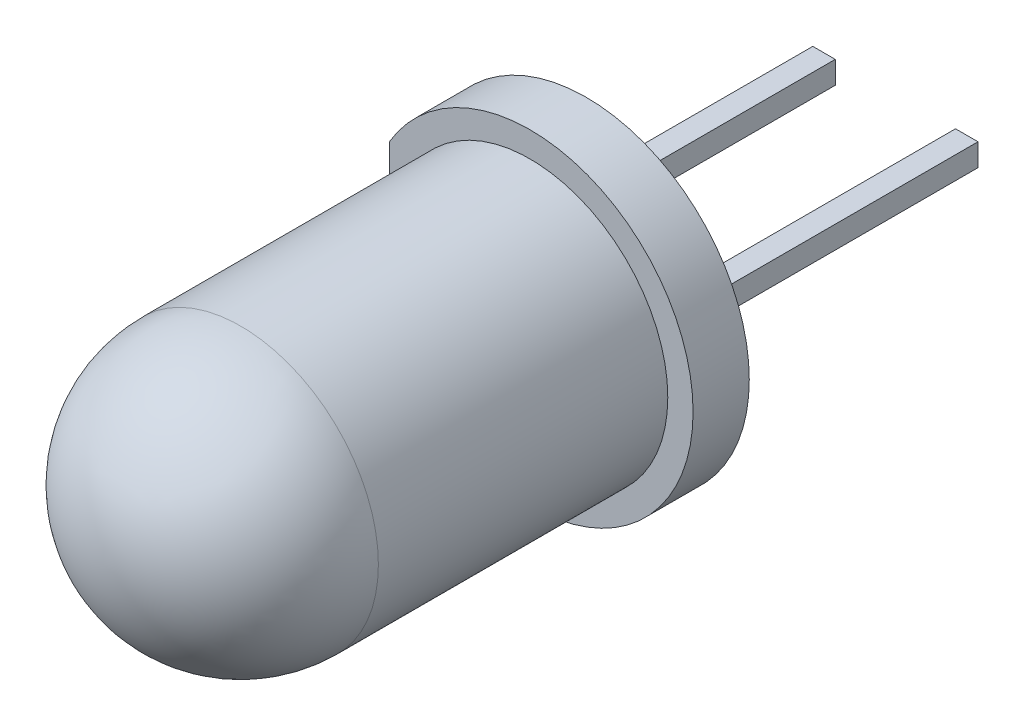
ISO-10303-21;
HEADER;
FILE_DESCRIPTION(('STEP AP214'),'2;1');
FILE_NAME('part.step','',(''),(''),'','','');
FILE_SCHEMA(('AUTOMOTIVE_DESIGN { 1 0 10303 214 1 1 1 1 }'));
ENDSEC;
DATA;
#1=APPLICATION_CONTEXT('core data for automotive mechanical design processes');
#2=APPLICATION_PROTOCOL_DEFINITION('international standard','automotive_design',2000,#1);
#3=PRODUCT_CONTEXT('',#1,'mechanical');
#4=PRODUCT('Part','Part','',(#3));
#5=PRODUCT_RELATED_PRODUCT_CATEGORY('part','',(#4));
#6=PRODUCT_DEFINITION_FORMATION('','',#4);
#7=PRODUCT_DEFINITION_CONTEXT('part definition',#1,'design');
#8=PRODUCT_DEFINITION('design','',#6,#7);
#9=PRODUCT_DEFINITION_SHAPE('','',#8);
#10=(LENGTH_UNIT() NAMED_UNIT(*) SI_UNIT(.MILLI.,.METRE.));
#11=(NAMED_UNIT(*) PLANE_ANGLE_UNIT() SI_UNIT($,.RADIAN.));
#12=(NAMED_UNIT(*) SI_UNIT($,.STERADIAN.) SOLID_ANGLE_UNIT());
#13=UNCERTAINTY_MEASURE_WITH_UNIT(LENGTH_MEASURE(1.E-05),#10,'distance_accuracy_value','');
#14=(GEOMETRIC_REPRESENTATION_CONTEXT(3) GLOBAL_UNCERTAINTY_ASSIGNED_CONTEXT((#13)) GLOBAL_UNIT_ASSIGNED_CONTEXT((#10,
#11,#12)) REPRESENTATION_CONTEXT('',''));
#15=CARTESIAN_POINT('',(0.,0.,0.));
#16=DIRECTION('',(0.,0.,1.));
#17=DIRECTION('',(1.,0.,0.));
#18=AXIS2_PLACEMENT_3D('',#15,#16,#17);
#19=CARTESIAN_POINT('',(2.34,0.2,-2.5));
#20=DIRECTION('',(0.,0.,1.));
#21=DIRECTION('',(1.,0.,0.));
#22=AXIS2_PLACEMENT_3D('',#19,#20,#21);
#23=PLANE('',#22);
#24=DIRECTION('',(1.,0.,0.));
#25=VECTOR('',#24,1.);
#26=CARTESIAN_POINT('',(2.34,0.2,-2.5));
#27=LINE('',#26,#25);
#28=CARTESIAN_POINT('',(2.34,0.2,-2.5));
#29=VERTEX_POINT('',#28);
#30=CARTESIAN_POINT('',(2.74,0.2,-2.5));
#31=VERTEX_POINT('',#30);
#32=EDGE_CURVE('E137',#29,#31,#27,.T.);
#33=ORIENTED_EDGE('',*,*,#32,.T.);
#34=DIRECTION('',(0.,-1.,0.));
#35=VECTOR('',#34,1.);
#36=CARTESIAN_POINT('',(2.74,0.2,-2.5));
#37=LINE('',#36,#35);
#38=CARTESIAN_POINT('',(2.74,-0.2,-2.5));
#39=VERTEX_POINT('',#38);
#40=EDGE_CURVE('E21',#31,#39,#37,.T.);
#41=ORIENTED_EDGE('',*,*,#40,.T.);
#42=DIRECTION('',(-1.,0.,0.));
#43=VECTOR('',#42,1.);
#44=CARTESIAN_POINT('',(2.74,-0.2,-2.5));
#45=LINE('',#44,#43);
#46=CARTESIAN_POINT('',(2.34,-0.2,-2.5));
#47=VERTEX_POINT('',#46);
#48=EDGE_CURVE('E11',#39,#47,#45,.T.);
#49=ORIENTED_EDGE('',*,*,#48,.T.);
#50=DIRECTION('',(0.,1.,0.));
#51=VECTOR('',#50,1.);
#52=CARTESIAN_POINT('',(2.34,-0.2,-2.5));
#53=LINE('',#52,#51);
#54=EDGE_CURVE('E143',#47,#29,#53,.T.);
#55=ORIENTED_EDGE('',*,*,#54,.T.);
#56=EDGE_LOOP('',(#33,#41,#49,#55));
#57=FACE_BOUND('',#56,.T.);
#58=ADVANCED_FACE('F17',(#57),#23,.F.);
#59=CARTESIAN_POINT('',(-0.2,0.2,-2.5));
#60=DIRECTION('',(0.,0.,1.));
#61=DIRECTION('',(1.,0.,0.));
#62=AXIS2_PLACEMENT_3D('',#59,#60,#61);
#63=PLANE('',#62);
#64=DIRECTION('',(1.,0.,0.));
#65=VECTOR('',#64,1.);
#66=CARTESIAN_POINT('',(-0.2,0.2,-2.5));
#67=LINE('',#66,#65);
#68=CARTESIAN_POINT('',(-0.2,0.2,-2.5));
#69=VERTEX_POINT('',#68);
#70=CARTESIAN_POINT('',(0.2,0.2,-2.5));
#71=VERTEX_POINT('',#70);
#72=EDGE_CURVE('E183',#69,#71,#67,.T.);
#73=ORIENTED_EDGE('',*,*,#72,.T.);
#74=DIRECTION('',(0.,-1.,0.));
#75=VECTOR('',#74,1.);
#76=CARTESIAN_POINT('',(0.2,0.2,-2.5));
#77=LINE('',#76,#75);
#78=CARTESIAN_POINT('',(0.2,-0.2,-2.5));
#79=VERTEX_POINT('',#78);
#80=EDGE_CURVE('E144',#71,#79,#77,.T.);
#81=ORIENTED_EDGE('',*,*,#80,.T.);
#82=DIRECTION('',(-1.,0.,0.));
#83=VECTOR('',#82,1.);
#84=CARTESIAN_POINT('',(0.2,-0.2,-2.5));
#85=LINE('',#84,#83);
#86=CARTESIAN_POINT('',(-0.2,-0.2,-2.5));
#87=VERTEX_POINT('',#86);
#88=EDGE_CURVE('E178',#79,#87,#85,.T.);
#89=ORIENTED_EDGE('',*,*,#88,.T.);
#90=DIRECTION('',(0.,1.,0.));
#91=VECTOR('',#90,1.);
#92=CARTESIAN_POINT('',(-0.2,-0.2,-2.5));
#93=LINE('',#92,#91);
#94=EDGE_CURVE('E192',#87,#69,#93,.T.);
#95=ORIENTED_EDGE('',*,*,#94,.T.);
#96=EDGE_LOOP('',(#73,#81,#89,#95));
#97=FACE_BOUND('',#96,.T.);
#98=ADVANCED_FACE('F215',(#97),#63,.F.);
#99=CARTESIAN_POINT('',(2.74,-0.2,3.5));
#100=DIRECTION('',(0.,1.,0.));
#101=DIRECTION('',(1.,0.,0.));
#102=AXIS2_PLACEMENT_3D('',#99,#100,#101);
#103=PLANE('',#102);
#104=DIRECTION('',(0.,0.,-1.));
#105=VECTOR('',#104,1.);
#106=CARTESIAN_POINT('',(2.34,-0.2,3.5));
#107=LINE('',#106,#105);
#108=CARTESIAN_POINT('',(2.34,-0.2,3.));
#109=VERTEX_POINT('',#108);
#110=EDGE_CURVE('E158',#109,#47,#107,.T.);
#111=ORIENTED_EDGE('',*,*,#110,.T.);
#112=ORIENTED_EDGE('',*,*,#48,.F.);
#113=DIRECTION('',(0.,0.,-1.));
#114=VECTOR('',#113,1.);
#115=CARTESIAN_POINT('',(2.74,-0.2,3.5));
#116=LINE('',#115,#114);
#117=CARTESIAN_POINT('',(2.74,-0.2,3.));
#118=VERTEX_POINT('',#117);
#119=EDGE_CURVE('E206',#118,#39,#116,.T.);
#120=ORIENTED_EDGE('',*,*,#119,.F.);
#121=DIRECTION('',(1.,0.,0.));
#122=VECTOR('',#121,1.);
#123=CARTESIAN_POINT('',(0.755,-0.2,3.));
#124=LINE('',#123,#122);
#125=EDGE_CURVE('E161',#109,#118,#124,.T.);
#126=ORIENTED_EDGE('',*,*,#125,.F.);
#127=EDGE_LOOP('',(#111,#112,#120,#126));
#128=FACE_BOUND('',#127,.T.);
#129=ADVANCED_FACE('F19',(#128),#103,.F.);
#130=CARTESIAN_POINT('',(2.74,0.2,3.5));
#131=DIRECTION('',(-1.,0.,0.));
#132=DIRECTION('',(0.,0.,1.));
#133=AXIS2_PLACEMENT_3D('',#130,#131,#132);
#134=PLANE('',#133);
#135=ORIENTED_EDGE('',*,*,#119,.T.);
#136=ORIENTED_EDGE('',*,*,#40,.F.);
#137=DIRECTION('',(0.,0.,-1.));
#138=VECTOR('',#137,1.);
#139=CARTESIAN_POINT('',(2.74,0.2,3.5));
#140=LINE('',#139,#138);
#141=CARTESIAN_POINT('',(2.74,0.2,3.));
#142=VERTEX_POINT('',#141);
#143=EDGE_CURVE('E202',#142,#31,#140,.T.);
#144=ORIENTED_EDGE('',*,*,#143,.F.);
#145=DIRECTION('',(0.,1.,0.));
#146=VECTOR('',#145,1.);
#147=CARTESIAN_POINT('',(2.74,-0.634846922835,3.));
#148=LINE('',#147,#146);
#149=EDGE_CURVE('E153',#118,#142,#148,.T.);
#150=ORIENTED_EDGE('',*,*,#149,.F.);
#151=EDGE_LOOP('',(#135,#136,#144,#150));
#152=FACE_BOUND('',#151,.T.);
#153=ADVANCED_FACE('F213',(#152),#134,.F.);
#154=CARTESIAN_POINT('',(2.34,0.2,3.5));
#155=DIRECTION('',(0.,-1.,0.));
#156=DIRECTION('',(0.,0.,-1.));
#157=AXIS2_PLACEMENT_3D('',#154,#155,#156);
#158=PLANE('',#157);
#159=ORIENTED_EDGE('',*,*,#143,.T.);
#160=ORIENTED_EDGE('',*,*,#32,.F.);
#161=DIRECTION('',(0.,0.,-1.));
#162=VECTOR('',#161,1.);
#163=CARTESIAN_POINT('',(2.34,0.2,3.5));
#164=LINE('',#163,#162);
#165=CARTESIAN_POINT('',(2.34,0.2,3.));
#166=VERTEX_POINT('',#165);
#167=EDGE_CURVE('E131',#166,#29,#164,.T.);
#168=ORIENTED_EDGE('',*,*,#167,.F.);
#169=DIRECTION('',(-1.,0.,0.));
#170=VECTOR('',#169,1.);
#171=CARTESIAN_POINT('',(0.555,0.2,3.));
#172=LINE('',#171,#170);
#173=EDGE_CURVE('E135',#142,#166,#172,.T.);
#174=ORIENTED_EDGE('',*,*,#173,.F.);
#175=EDGE_LOOP('',(#159,#160,#168,#174));
#176=FACE_BOUND('',#175,.T.);
#177=ADVANCED_FACE('F134',(#176),#158,.F.);
#178=CARTESIAN_POINT('',(2.34,-0.2,3.5));
#179=DIRECTION('',(1.,0.,0.));
#180=DIRECTION('',(0.,1.,0.));
#181=AXIS2_PLACEMENT_3D('',#178,#179,#180);
#182=PLANE('',#181);
#183=ORIENTED_EDGE('',*,*,#167,.T.);
#184=ORIENTED_EDGE('',*,*,#54,.F.);
#185=ORIENTED_EDGE('',*,*,#110,.F.);
#186=DIRECTION('',(0.,-1.,0.));
#187=VECTOR('',#186,1.);
#188=CARTESIAN_POINT('',(2.34,-0.834846922835,3.));
#189=LINE('',#188,#187);
#190=EDGE_CURVE('E151',#166,#109,#189,.T.);
#191=ORIENTED_EDGE('',*,*,#190,.F.);
#192=EDGE_LOOP('',(#183,#184,#185,#191));
#193=FACE_BOUND('',#192,.T.);
#194=ADVANCED_FACE('F157',(#193),#182,.F.);
#195=CARTESIAN_POINT('',(0.2,0.2,3.5));
#196=DIRECTION('',(-1.,0.,0.));
#197=DIRECTION('',(0.,0.,1.));
#198=AXIS2_PLACEMENT_3D('',#195,#196,#197);
#199=PLANE('',#198);
#200=DIRECTION('',(0.,0.,-1.));
#201=VECTOR('',#200,1.);
#202=CARTESIAN_POINT('',(0.2,-0.2,3.5));
#203=LINE('',#202,#201);
#204=CARTESIAN_POINT('',(0.2,-0.2,3.));
#205=VERTEX_POINT('',#204);
#206=EDGE_CURVE('E187',#205,#79,#203,.T.);
#207=ORIENTED_EDGE('',*,*,#206,.T.);
#208=ORIENTED_EDGE('',*,*,#80,.F.);
#209=DIRECTION('',(0.,0.,-1.));
#210=VECTOR('',#209,1.);
#211=CARTESIAN_POINT('',(0.2,0.2,3.5));
#212=LINE('',#211,#210);
#213=CARTESIAN_POINT('',(0.2,0.2,3.));
#214=VERTEX_POINT('',#213);
#215=EDGE_CURVE('E193',#214,#71,#212,.T.);
#216=ORIENTED_EDGE('',*,*,#215,.F.);
#217=DIRECTION('',(0.,1.,0.));
#218=VECTOR('',#217,1.);
#219=CARTESIAN_POINT('',(0.2,-0.634846922835,3.));
#220=LINE('',#219,#218);
#221=EDGE_CURVE('E445',#205,#214,#220,.T.);
#222=ORIENTED_EDGE('',*,*,#221,.F.);
#223=EDGE_LOOP('',(#207,#208,#216,#222));
#224=FACE_BOUND('',#223,.T.);
#225=ADVANCED_FACE('F237',(#224),#199,.F.);
#226=CARTESIAN_POINT('',(-0.2,0.2,3.5));
#227=DIRECTION('',(0.,-1.,0.));
#228=DIRECTION('',(0.,0.,-1.));
#229=AXIS2_PLACEMENT_3D('',#226,#227,#228);
#230=PLANE('',#229);
#231=ORIENTED_EDGE('',*,*,#215,.T.);
#232=ORIENTED_EDGE('',*,*,#72,.F.);
#233=DIRECTION('',(0.,0.,-1.));
#234=VECTOR('',#233,1.);
#235=CARTESIAN_POINT('',(-0.2,0.2,3.5));
#236=LINE('',#235,#234);
#237=CARTESIAN_POINT('',(-0.2,0.2,3.));
#238=VERTEX_POINT('',#237);
#239=EDGE_CURVE('E188',#238,#69,#236,.T.);
#240=ORIENTED_EDGE('',*,*,#239,.F.);
#241=DIRECTION('',(-1.,0.,0.));
#242=VECTOR('',#241,1.);
#243=CARTESIAN_POINT('',(-0.715,0.2,3.));
#244=LINE('',#243,#242);
#245=EDGE_CURVE('E169',#214,#238,#244,.T.);
#246=ORIENTED_EDGE('',*,*,#245,.F.);
#247=EDGE_LOOP('',(#231,#232,#240,#246));
#248=FACE_BOUND('',#247,.T.);
#249=ADVANCED_FACE('F240',(#248),#230,.F.);
#250=CARTESIAN_POINT('',(-0.2,-0.2,3.5));
#251=DIRECTION('',(1.,0.,0.));
#252=DIRECTION('',(0.,1.,0.));
#253=AXIS2_PLACEMENT_3D('',#250,#251,#252);
#254=PLANE('',#253);
#255=ORIENTED_EDGE('',*,*,#239,.T.);
#256=ORIENTED_EDGE('',*,*,#94,.F.);
#257=DIRECTION('',(0.,0.,-1.));
#258=VECTOR('',#257,1.);
#259=CARTESIAN_POINT('',(-0.2,-0.2,3.5));
#260=LINE('',#259,#258);
#261=CARTESIAN_POINT('',(-0.2,-0.2,3.));
#262=VERTEX_POINT('',#261);
#263=EDGE_CURVE('E155',#262,#87,#260,.T.);
#264=ORIENTED_EDGE('',*,*,#263,.F.);
#265=DIRECTION('',(0.,-1.,0.));
#266=VECTOR('',#265,1.);
#267=CARTESIAN_POINT('',(-0.2,-0.834846922835,3.));
#268=LINE('',#267,#266);
#269=EDGE_CURVE('E162',#238,#262,#268,.T.);
#270=ORIENTED_EDGE('',*,*,#269,.F.);
#271=EDGE_LOOP('',(#255,#256,#264,#270));
#272=FACE_BOUND('',#271,.T.);
#273=ADVANCED_FACE('F235',(#272),#254,.F.);
#274=CARTESIAN_POINT('',(0.2,-0.2,3.5));
#275=DIRECTION('',(0.,1.,0.));
#276=DIRECTION('',(1.,0.,0.));
#277=AXIS2_PLACEMENT_3D('',#274,#275,#276);
#278=PLANE('',#277);
#279=ORIENTED_EDGE('',*,*,#263,.T.);
#280=ORIENTED_EDGE('',*,*,#88,.F.);
#281=ORIENTED_EDGE('',*,*,#206,.F.);
#282=DIRECTION('',(1.,0.,0.));
#283=VECTOR('',#282,1.);
#284=CARTESIAN_POINT('',(-0.515,-0.2,3.));
#285=LINE('',#284,#283);
#286=EDGE_CURVE('E447',#262,#205,#285,.T.);
#287=ORIENTED_EDGE('',*,*,#286,.F.);
#288=EDGE_LOOP('',(#279,#280,#281,#287));
#289=FACE_BOUND('',#288,.T.);
#290=ADVANCED_FACE('F232',(#289),#278,.F.);
#291=CARTESIAN_POINT('',(-1.229999999999,-1.469693845671,3.));
#292=DIRECTION('',(0.,0.,-1.));
#293=DIRECTION('',(0.,-1.,0.));
#294=AXIS2_PLACEMENT_3D('',#291,#292,#293);
#295=PLANE('',#294);
#296=ORIENTED_EDGE('',*,*,#190,.T.);
#297=ORIENTED_EDGE('',*,*,#125,.T.);
#298=ORIENTED_EDGE('',*,*,#149,.T.);
#299=ORIENTED_EDGE('',*,*,#173,.T.);
#300=EDGE_LOOP('',(#296,#297,#298,#299));
#301=FACE_BOUND('',#300,.T.);
#302=ORIENTED_EDGE('',*,*,#286,.T.);
#303=ORIENTED_EDGE('',*,*,#221,.T.);
#304=ORIENTED_EDGE('',*,*,#245,.T.);
#305=ORIENTED_EDGE('',*,*,#269,.T.);
#306=EDGE_LOOP('',(#302,#303,#304,#305));
#307=FACE_BOUND('',#306,.T.);
#308=CARTESIAN_POINT('',(1.27,0.,3.));
#309=DIRECTION('',(0.,0.,1.));
#310=DIRECTION('',(1.,0.,0.));
#311=AXIS2_PLACEMENT_3D('',#308,#309,#310);
#312=CIRCLE('',#311,2.9);
#313=CARTESIAN_POINT('',(-1.229999999999,-1.46969384567,3.));
#314=VERTEX_POINT('',#313);
#315=CARTESIAN_POINT('',(-1.23,1.469693845669,3.));
#316=VERTEX_POINT('',#315);
#317=EDGE_CURVE('E472',#314,#316,#312,.T.);
#318=ORIENTED_EDGE('',*,*,#317,.F.);
#319=DIRECTION('',(0.,1.,0.));
#320=VECTOR('',#319,1.);
#321=CARTESIAN_POINT('',(-1.229999999999,-1.46969384567,3.));
#322=LINE('',#321,#320);
#323=EDGE_CURVE('E456',#314,#316,#322,.T.);
#324=ORIENTED_EDGE('',*,*,#323,.T.);
#325=EDGE_LOOP('',(#318,#324));
#326=FACE_BOUND('',#325,.T.);
#327=ADVANCED_FACE('F148',(#301,#307,#326),#295,.T.);
#328=CARTESIAN_POINT('',(-1.229999999999,-1.46969384567,3.));
#329=DIRECTION('',(-1.,0.,0.));
#330=DIRECTION('',(0.,0.,1.));
#331=AXIS2_PLACEMENT_3D('',#328,#329,#330);
#332=PLANE('',#331);
#333=DIRECTION('',(0.,0.,1.));
#334=VECTOR('',#333,1.);
#335=CARTESIAN_POINT('',(-1.229999999999,-1.46969384567,3.));
#336=LINE('',#335,#334);
#337=CARTESIAN_POINT('',(-1.229999999999,-1.46969384567,4.));
#338=VERTEX_POINT('',#337);
#339=EDGE_CURVE('E462',#314,#338,#336,.T.);
#340=ORIENTED_EDGE('',*,*,#339,.T.);
#341=DIRECTION('',(0.,1.,0.));
#342=VECTOR('',#341,1.);
#343=CARTESIAN_POINT('',(-1.229999999999,-1.46969384567,4.));
#344=LINE('',#343,#342);
#345=CARTESIAN_POINT('',(-1.23,1.469693845669,4.));
#346=VERTEX_POINT('',#345);
#347=EDGE_CURVE('E459',#338,#346,#344,.T.);
#348=ORIENTED_EDGE('',*,*,#347,.T.);
#349=DIRECTION('',(0.,0.,1.));
#350=VECTOR('',#349,1.);
#351=CARTESIAN_POINT('',(-1.23,1.469693845669,3.));
#352=LINE('',#351,#350);
#353=EDGE_CURVE('E469',#316,#346,#352,.T.);
#354=ORIENTED_EDGE('',*,*,#353,.F.);
#355=ORIENTED_EDGE('',*,*,#323,.F.);
#356=EDGE_LOOP('',(#340,#348,#354,#355));
#357=FACE_BOUND('',#356,.T.);
#358=ADVANCED_FACE('F292',(#357),#332,.T.);
#359=CARTESIAN_POINT('',(1.27,0.,3.));
#360=DIRECTION('',(0.,0.,-1.));
#361=DIRECTION('',(1.,0.,0.));
#362=AXIS2_PLACEMENT_3D('',#359,#360,#361);
#363=CYLINDRICAL_SURFACE('',#362,2.9);
#364=ORIENTED_EDGE('',*,*,#317,.T.);
#365=ORIENTED_EDGE('',*,*,#353,.T.);
#366=CARTESIAN_POINT('',(1.27,0.,4.));
#367=DIRECTION('',(0.,0.,1.));
#368=DIRECTION('',(1.,0.,0.));
#369=AXIS2_PLACEMENT_3D('',#366,#367,#368);
#370=CIRCLE('',#369,2.9);
#371=EDGE_CURVE('E444',#338,#346,#370,.T.);
#372=ORIENTED_EDGE('',*,*,#371,.F.);
#373=ORIENTED_EDGE('',*,*,#339,.F.);
#374=EDGE_LOOP('',(#364,#365,#372,#373));
#375=FACE_BOUND('',#374,.T.);
#376=ADVANCED_FACE('F303',(#375),#363,.T.);
#377=CARTESIAN_POINT('',(-1.229999999999,-1.469693845671,4.));
#378=DIRECTION('',(0.,0.,-1.));
#379=DIRECTION('',(0.,-1.,0.));
#380=AXIS2_PLACEMENT_3D('',#377,#378,#379);
#381=PLANE('',#380);
#382=CARTESIAN_POINT('',(1.27,0.,4.));
#383=DIRECTION('',(0.,0.,-1.));
#384=DIRECTION('',(1.,0.,0.));
#385=AXIS2_PLACEMENT_3D('',#382,#383,#384);
#386=CIRCLE('',#385,2.45);
#387=CARTESIAN_POINT('',(3.72,0.,4.));
#388=VERTEX_POINT('',#387);
#389=EDGE_CURVE('E452',#388,#388,#386,.T.);
#390=ORIENTED_EDGE('',*,*,#389,.T.);
#391=EDGE_LOOP('',(#390));
#392=FACE_BOUND('',#391,.T.);
#393=ORIENTED_EDGE('',*,*,#347,.F.);
#394=ORIENTED_EDGE('',*,*,#371,.T.);
#395=EDGE_LOOP('',(#393,#394));
#396=FACE_BOUND('',#395,.T.);
#397=ADVANCED_FACE('F315',(#392,#396),#381,.F.);
#398=CARTESIAN_POINT('',(1.27,0.,9.15));
#399=DIRECTION('',(0.,0.,-1.));
#400=DIRECTION('',(1.,0.,0.));
#401=AXIS2_PLACEMENT_3D('',#398,#399,#400);
#402=CYLINDRICAL_SURFACE('',#401,2.45);
#403=DIRECTION('',(0.,0.,-1.));
#404=VECTOR('',#403,1.);
#405=CARTESIAN_POINT('',(3.72,0.,9.15));
#406=LINE('',#405,#404);
#407=CARTESIAN_POINT('',(3.72,0.,9.15));
#408=VERTEX_POINT('',#407);
#409=EDGE_CURVE('E440',#408,#388,#406,.T.);
#410=ORIENTED_EDGE('',*,*,#409,.F.);
#411=CARTESIAN_POINT('',(1.27,0.,9.15));
#412=DIRECTION('',(0.,0.,-1.));
#413=DIRECTION('',(1.,0.,0.));
#414=AXIS2_PLACEMENT_3D('',#411,#412,#413);
#415=CIRCLE('',#414,2.45);
#416=EDGE_CURVE('E433',#408,#408,#415,.T.);
#417=ORIENTED_EDGE('',*,*,#416,.T.);
#418=ORIENTED_EDGE('',*,*,#409,.T.);
#419=ORIENTED_EDGE('',*,*,#389,.F.);
#420=EDGE_LOOP('',(#410,#417,#418,#419));
#421=FACE_BOUND('',#420,.T.);
#422=ADVANCED_FACE('F326',(#421),#402,.T.);
#423=CARTESIAN_POINT('',(1.27,0.,9.15));
#424=DIRECTION('',(0.,0.,1.));
#425=DIRECTION('',(1.,0.,0.));
#426=AXIS2_PLACEMENT_3D('',#423,#424,#425);
#427=SPHERICAL_SURFACE('',#426,2.45);
#428=CARTESIAN_POINT('',(1.27,0.,9.15));
#429=DIRECTION('',(0.,-1.,0.));
#430=DIRECTION('',(1.,0.,0.));
#431=AXIS2_PLACEMENT_3D('',#428,#429,#430);
#432=CIRCLE('',#431,2.45);
#433=CARTESIAN_POINT('',(1.27,0.,11.6));
#434=VERTEX_POINT('',#433);
#435=EDGE_CURVE('E431',#408,#434,#432,.T.);
#436=ORIENTED_EDGE('',*,*,#435,.T.);
#437=ORIENTED_EDGE('',*,*,#435,.F.);
#438=ORIENTED_EDGE('',*,*,#416,.F.);
#439=EDGE_LOOP('',(#436,#437,#438));
#440=FACE_BOUND('',#439,.T.);
#441=ADVANCED_FACE('F336',(#440),#427,.T.);
#442=CLOSED_SHELL('',(#58,#98,#129,#153,#177,#194,#225,#249,#273,#290,#327,#358,#376,#397,#422,#441));
#443=MANIFOLD_SOLID_BREP('B1',#442);
#444=ADVANCED_BREP_SHAPE_REPRESENTATION('',(#18,#443),#14);
#445=SHAPE_DEFINITION_REPRESENTATION(#9,#444);
ENDSEC;
END-ISO-10303-21;
